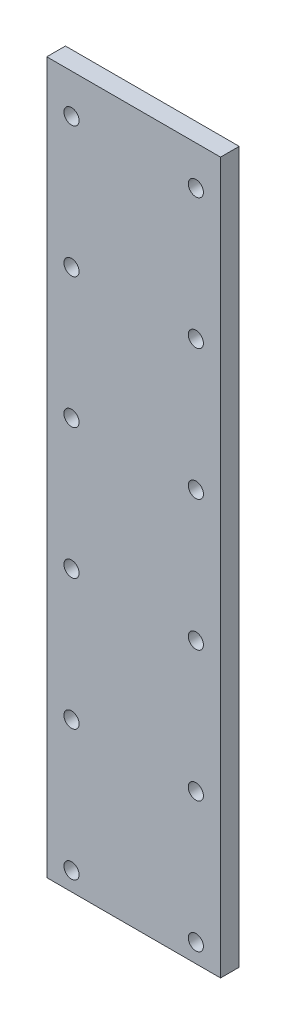
ISO-10303-21;
HEADER;
FILE_DESCRIPTION(('STEP AP214'),'2;1');
FILE_NAME('part.step','',(''),(''),'','','');
FILE_SCHEMA(('AUTOMOTIVE_DESIGN { 1 0 10303 214 1 1 1 1 }'));
ENDSEC;
DATA;
#1=APPLICATION_CONTEXT('core data for automotive mechanical design processes');
#2=APPLICATION_PROTOCOL_DEFINITION('international standard','automotive_design',2000,#1);
#3=PRODUCT_CONTEXT('',#1,'mechanical');
#4=PRODUCT('Part','Part','',(#3));
#5=PRODUCT_RELATED_PRODUCT_CATEGORY('part','',(#4));
#6=PRODUCT_DEFINITION_FORMATION('','',#4);
#7=PRODUCT_DEFINITION_CONTEXT('part definition',#1,'design');
#8=PRODUCT_DEFINITION('design','',#6,#7);
#9=PRODUCT_DEFINITION_SHAPE('','',#8);
#10=(LENGTH_UNIT() NAMED_UNIT(*) SI_UNIT(.MILLI.,.METRE.));
#11=(NAMED_UNIT(*) PLANE_ANGLE_UNIT() SI_UNIT($,.RADIAN.));
#12=(NAMED_UNIT(*) SI_UNIT($,.STERADIAN.) SOLID_ANGLE_UNIT());
#13=UNCERTAINTY_MEASURE_WITH_UNIT(LENGTH_MEASURE(1.E-05),#10,'distance_accuracy_value','');
#14=(GEOMETRIC_REPRESENTATION_CONTEXT(3) GLOBAL_UNCERTAINTY_ASSIGNED_CONTEXT((#13)) GLOBAL_UNIT_ASSIGNED_CONTEXT((#10,
#11,#12)) REPRESENTATION_CONTEXT('',''));
#15=CARTESIAN_POINT('',(0.,0.,0.));
#16=DIRECTION('',(0.,0.,1.));
#17=DIRECTION('',(1.,0.,0.));
#18=AXIS2_PLACEMENT_3D('',#15,#16,#17);
#19=CARTESIAN_POINT('',(9.9949,50.85,0.));
#20=DIRECTION('',(0.,0.,1.));
#21=DIRECTION('',(1.,0.,0.));
#22=AXIS2_PLACEMENT_3D('',#19,#20,#21);
#23=CYLINDRICAL_SURFACE('',#22,1.2192);
#24=CARTESIAN_POINT('',(9.9949,50.85,0.));
#25=DIRECTION('',(0.,0.,1.));
#26=DIRECTION('',(1.,0.,0.));
#27=AXIS2_PLACEMENT_3D('',#24,#25,#26);
#28=CIRCLE('',#27,1.2192);
#29=CARTESIAN_POINT('',(11.2141,50.85,0.));
#30=VERTEX_POINT('',#29);
#31=EDGE_CURVE('E53',#30,#30,#28,.T.);
#32=ORIENTED_EDGE('',*,*,#31,.F.);
#33=EDGE_LOOP('',(#32));
#34=FACE_BOUND('',#33,.T.);
#35=CARTESIAN_POINT('',(9.9949,50.85,3.));
#36=DIRECTION('',(0.,0.,1.));
#37=DIRECTION('',(1.,0.,0.));
#38=AXIS2_PLACEMENT_3D('',#35,#36,#37);
#39=CIRCLE('',#38,1.2192);
#40=CARTESIAN_POINT('',(11.2141,50.85,3.));
#41=VERTEX_POINT('',#40);
#42=EDGE_CURVE('E11',#41,#41,#39,.T.);
#43=ORIENTED_EDGE('',*,*,#42,.T.);
#44=EDGE_LOOP('',(#43));
#45=FACE_BOUND('',#44,.T.);
#46=ADVANCED_FACE('F44',(#34,#45),#23,.F.);
#47=CARTESIAN_POINT('',(9.9949,29.85,0.));
#48=DIRECTION('',(0.,0.,1.));
#49=DIRECTION('',(1.,0.,0.));
#50=AXIS2_PLACEMENT_3D('',#47,#48,#49);
#51=CYLINDRICAL_SURFACE('',#50,1.2192);
#52=CARTESIAN_POINT('',(9.9949,29.85,0.));
#53=DIRECTION('',(0.,0.,1.));
#54=DIRECTION('',(1.,0.,0.));
#55=AXIS2_PLACEMENT_3D('',#52,#53,#54);
#56=CIRCLE('',#55,1.2192);
#57=CARTESIAN_POINT('',(11.2141,29.85,0.));
#58=VERTEX_POINT('',#57);
#59=EDGE_CURVE('E182',#58,#58,#56,.T.);
#60=ORIENTED_EDGE('',*,*,#59,.F.);
#61=EDGE_LOOP('',(#60));
#62=FACE_BOUND('',#61,.T.);
#63=CARTESIAN_POINT('',(9.9949,29.85,3.));
#64=DIRECTION('',(0.,0.,1.));
#65=DIRECTION('',(1.,0.,0.));
#66=AXIS2_PLACEMENT_3D('',#63,#64,#65);
#67=CIRCLE('',#66,1.2192);
#68=CARTESIAN_POINT('',(11.2141,29.85,3.));
#69=VERTEX_POINT('',#68);
#70=EDGE_CURVE('E186',#69,#69,#67,.T.);
#71=ORIENTED_EDGE('',*,*,#70,.T.);
#72=EDGE_LOOP('',(#71));
#73=FACE_BOUND('',#72,.T.);
#74=ADVANCED_FACE('F197',(#62,#73),#51,.F.);
#75=CARTESIAN_POINT('',(9.9949,8.84999999999998,0.));
#76=DIRECTION('',(0.,0.,1.));
#77=DIRECTION('',(1.,0.,0.));
#78=AXIS2_PLACEMENT_3D('',#75,#76,#77);
#79=CYLINDRICAL_SURFACE('',#78,1.2192);
#80=CARTESIAN_POINT('',(9.9949,8.84999999999998,0.));
#81=DIRECTION('',(0.,0.,1.));
#82=DIRECTION('',(1.,0.,0.));
#83=AXIS2_PLACEMENT_3D('',#80,#81,#82);
#84=CIRCLE('',#83,1.2192);
#85=CARTESIAN_POINT('',(11.2141,8.84999999999998,0.));
#86=VERTEX_POINT('',#85);
#87=EDGE_CURVE('E174',#86,#86,#84,.T.);
#88=ORIENTED_EDGE('',*,*,#87,.F.);
#89=EDGE_LOOP('',(#88));
#90=FACE_BOUND('',#89,.T.);
#91=CARTESIAN_POINT('',(9.9949,8.84999999999998,3.));
#92=DIRECTION('',(0.,0.,1.));
#93=DIRECTION('',(1.,0.,0.));
#94=AXIS2_PLACEMENT_3D('',#91,#92,#93);
#95=CIRCLE('',#94,1.2192);
#96=CARTESIAN_POINT('',(11.2141,8.84999999999998,3.));
#97=VERTEX_POINT('',#96);
#98=EDGE_CURVE('E178',#97,#97,#95,.T.);
#99=ORIENTED_EDGE('',*,*,#98,.T.);
#100=EDGE_LOOP('',(#99));
#101=FACE_BOUND('',#100,.T.);
#102=ADVANCED_FACE('F244',(#90,#101),#79,.F.);
#103=CARTESIAN_POINT('',(9.9949,-12.15,0.));
#104=DIRECTION('',(0.,0.,1.));
#105=DIRECTION('',(1.,0.,0.));
#106=AXIS2_PLACEMENT_3D('',#103,#104,#105);
#107=CYLINDRICAL_SURFACE('',#106,1.2192);
#108=CARTESIAN_POINT('',(9.9949,-12.15,0.));
#109=DIRECTION('',(0.,0.,1.));
#110=DIRECTION('',(1.,0.,0.));
#111=AXIS2_PLACEMENT_3D('',#108,#109,#110);
#112=CIRCLE('',#111,1.2192);
#113=CARTESIAN_POINT('',(11.2141,-12.15,0.));
#114=VERTEX_POINT('',#113);
#115=EDGE_CURVE('E166',#114,#114,#112,.T.);
#116=ORIENTED_EDGE('',*,*,#115,.F.);
#117=EDGE_LOOP('',(#116));
#118=FACE_BOUND('',#117,.T.);
#119=CARTESIAN_POINT('',(9.9949,-12.15,3.));
#120=DIRECTION('',(0.,0.,1.));
#121=DIRECTION('',(1.,0.,0.));
#122=AXIS2_PLACEMENT_3D('',#119,#120,#121);
#123=CIRCLE('',#122,1.2192);
#124=CARTESIAN_POINT('',(11.2141,-12.15,3.));
#125=VERTEX_POINT('',#124);
#126=EDGE_CURVE('E170',#125,#125,#123,.T.);
#127=ORIENTED_EDGE('',*,*,#126,.T.);
#128=EDGE_LOOP('',(#127));
#129=FACE_BOUND('',#128,.T.);
#130=ADVANCED_FACE('F240',(#118,#129),#107,.F.);
#131=CARTESIAN_POINT('',(-9.9949,50.85,0.));
#132=DIRECTION('',(0.,0.,1.));
#133=DIRECTION('',(1.,0.,0.));
#134=AXIS2_PLACEMENT_3D('',#131,#132,#133);
#135=CYLINDRICAL_SURFACE('',#134,1.2192);
#136=CARTESIAN_POINT('',(-9.9949,50.85,0.));
#137=DIRECTION('',(0.,0.,1.));
#138=DIRECTION('',(1.,0.,0.));
#139=AXIS2_PLACEMENT_3D('',#136,#137,#138);
#140=CIRCLE('',#139,1.2192);
#141=CARTESIAN_POINT('',(-8.7757,50.85,0.));
#142=VERTEX_POINT('',#141);
#143=EDGE_CURVE('E158',#142,#142,#140,.T.);
#144=ORIENTED_EDGE('',*,*,#143,.F.);
#145=EDGE_LOOP('',(#144));
#146=FACE_BOUND('',#145,.T.);
#147=CARTESIAN_POINT('',(-9.9949,50.85,3.));
#148=DIRECTION('',(0.,0.,1.));
#149=DIRECTION('',(1.,0.,0.));
#150=AXIS2_PLACEMENT_3D('',#147,#148,#149);
#151=CIRCLE('',#150,1.2192);
#152=CARTESIAN_POINT('',(-8.7757,50.85,3.));
#153=VERTEX_POINT('',#152);
#154=EDGE_CURVE('E162',#153,#153,#151,.T.);
#155=ORIENTED_EDGE('',*,*,#154,.T.);
#156=EDGE_LOOP('',(#155));
#157=FACE_BOUND('',#156,.T.);
#158=ADVANCED_FACE('F236',(#146,#157),#135,.F.);
#159=CARTESIAN_POINT('',(-9.9949,29.85,0.));
#160=DIRECTION('',(0.,0.,1.));
#161=DIRECTION('',(1.,0.,0.));
#162=AXIS2_PLACEMENT_3D('',#159,#160,#161);
#163=CYLINDRICAL_SURFACE('',#162,1.2192);
#164=CARTESIAN_POINT('',(-9.9949,29.85,0.));
#165=DIRECTION('',(0.,0.,1.));
#166=DIRECTION('',(1.,0.,0.));
#167=AXIS2_PLACEMENT_3D('',#164,#165,#166);
#168=CIRCLE('',#167,1.2192);
#169=CARTESIAN_POINT('',(-8.7757,29.85,0.));
#170=VERTEX_POINT('',#169);
#171=EDGE_CURVE('E150',#170,#170,#168,.T.);
#172=ORIENTED_EDGE('',*,*,#171,.F.);
#173=EDGE_LOOP('',(#172));
#174=FACE_BOUND('',#173,.T.);
#175=CARTESIAN_POINT('',(-9.9949,29.85,3.));
#176=DIRECTION('',(0.,0.,1.));
#177=DIRECTION('',(1.,0.,0.));
#178=AXIS2_PLACEMENT_3D('',#175,#176,#177);
#179=CIRCLE('',#178,1.2192);
#180=CARTESIAN_POINT('',(-8.7757,29.85,3.));
#181=VERTEX_POINT('',#180);
#182=EDGE_CURVE('E154',#181,#181,#179,.T.);
#183=ORIENTED_EDGE('',*,*,#182,.T.);
#184=EDGE_LOOP('',(#183));
#185=FACE_BOUND('',#184,.T.);
#186=ADVANCED_FACE('F232',(#174,#185),#163,.F.);
#187=CARTESIAN_POINT('',(-9.9949,8.84999999999998,0.));
#188=DIRECTION('',(0.,0.,1.));
#189=DIRECTION('',(1.,0.,0.));
#190=AXIS2_PLACEMENT_3D('',#187,#188,#189);
#191=CYLINDRICAL_SURFACE('',#190,1.2192);
#192=CARTESIAN_POINT('',(-9.9949,8.84999999999998,0.));
#193=DIRECTION('',(0.,0.,1.));
#194=DIRECTION('',(1.,0.,0.));
#195=AXIS2_PLACEMENT_3D('',#192,#193,#194);
#196=CIRCLE('',#195,1.2192);
#197=CARTESIAN_POINT('',(-8.7757,8.84999999999998,0.));
#198=VERTEX_POINT('',#197);
#199=EDGE_CURVE('E142',#198,#198,#196,.T.);
#200=ORIENTED_EDGE('',*,*,#199,.F.);
#201=EDGE_LOOP('',(#200));
#202=FACE_BOUND('',#201,.T.);
#203=CARTESIAN_POINT('',(-9.9949,8.84999999999998,3.));
#204=DIRECTION('',(0.,0.,1.));
#205=DIRECTION('',(1.,0.,0.));
#206=AXIS2_PLACEMENT_3D('',#203,#204,#205);
#207=CIRCLE('',#206,1.2192);
#208=CARTESIAN_POINT('',(-8.7757,8.84999999999998,3.));
#209=VERTEX_POINT('',#208);
#210=EDGE_CURVE('E146',#209,#209,#207,.T.);
#211=ORIENTED_EDGE('',*,*,#210,.T.);
#212=EDGE_LOOP('',(#211));
#213=FACE_BOUND('',#212,.T.);
#214=ADVANCED_FACE('F228',(#202,#213),#191,.F.);
#215=CARTESIAN_POINT('',(-9.9949,-12.15,0.));
#216=DIRECTION('',(0.,0.,1.));
#217=DIRECTION('',(1.,0.,0.));
#218=AXIS2_PLACEMENT_3D('',#215,#216,#217);
#219=CYLINDRICAL_SURFACE('',#218,1.2192);
#220=CARTESIAN_POINT('',(-9.9949,-12.15,0.));
#221=DIRECTION('',(0.,0.,1.));
#222=DIRECTION('',(1.,0.,0.));
#223=AXIS2_PLACEMENT_3D('',#220,#221,#222);
#224=CIRCLE('',#223,1.2192);
#225=CARTESIAN_POINT('',(-8.7757,-12.15,0.));
#226=VERTEX_POINT('',#225);
#227=EDGE_CURVE('E134',#226,#226,#224,.T.);
#228=ORIENTED_EDGE('',*,*,#227,.F.);
#229=EDGE_LOOP('',(#228));
#230=FACE_BOUND('',#229,.T.);
#231=CARTESIAN_POINT('',(-9.9949,-12.15,3.));
#232=DIRECTION('',(0.,0.,1.));
#233=DIRECTION('',(1.,0.,0.));
#234=AXIS2_PLACEMENT_3D('',#231,#232,#233);
#235=CIRCLE('',#234,1.2192);
#236=CARTESIAN_POINT('',(-8.7757,-12.15,3.));
#237=VERTEX_POINT('',#236);
#238=EDGE_CURVE('E138',#237,#237,#235,.T.);
#239=ORIENTED_EDGE('',*,*,#238,.T.);
#240=EDGE_LOOP('',(#239));
#241=FACE_BOUND('',#240,.T.);
#242=ADVANCED_FACE('F225',(#230,#241),#219,.F.);
#243=CARTESIAN_POINT('',(13.97,-57.15,3.));
#244=DIRECTION('',(-1.,0.,0.));
#245=DIRECTION('',(0.,0.,1.));
#246=AXIS2_PLACEMENT_3D('',#243,#244,#245);
#247=PLANE('',#246);
#248=DIRECTION('',(0.,1.,0.));
#249=VECTOR('',#248,1.);
#250=CARTESIAN_POINT('',(13.97,-57.15,0.));
#251=LINE('',#250,#249);
#252=CARTESIAN_POINT('',(13.97,-57.15,0.));
#253=VERTEX_POINT('',#252);
#254=CARTESIAN_POINT('',(13.97,57.15,0.));
#255=VERTEX_POINT('',#254);
#256=EDGE_CURVE('E117',#253,#255,#251,.T.);
#257=ORIENTED_EDGE('',*,*,#256,.T.);
#258=DIRECTION('',(0.,0.,-1.));
#259=VECTOR('',#258,1.);
#260=CARTESIAN_POINT('',(13.97,57.15,3.));
#261=LINE('',#260,#259);
#262=CARTESIAN_POINT('',(13.97,57.15,3.));
#263=VERTEX_POINT('',#262);
#264=EDGE_CURVE('E106',#263,#255,#261,.T.);
#265=ORIENTED_EDGE('',*,*,#264,.F.);
#266=DIRECTION('',(0.,1.,0.));
#267=VECTOR('',#266,1.);
#268=CARTESIAN_POINT('',(13.97,-57.15,3.));
#269=LINE('',#268,#267);
#270=CARTESIAN_POINT('',(13.97,-57.15,3.));
#271=VERTEX_POINT('',#270);
#272=EDGE_CURVE('E98',#271,#263,#269,.T.);
#273=ORIENTED_EDGE('',*,*,#272,.F.);
#274=DIRECTION('',(0.,0.,-1.));
#275=VECTOR('',#274,1.);
#276=CARTESIAN_POINT('',(13.97,-57.15,3.));
#277=LINE('',#276,#275);
#278=EDGE_CURVE('E113',#271,#253,#277,.T.);
#279=ORIENTED_EDGE('',*,*,#278,.T.);
#280=EDGE_LOOP('',(#257,#265,#273,#279));
#281=FACE_BOUND('',#280,.T.);
#282=ADVANCED_FACE('F222',(#281),#247,.F.);
#283=CARTESIAN_POINT('',(-13.97,57.15,3.));
#284=DIRECTION('',(0.,-1.,0.));
#285=DIRECTION('',(0.,0.,-1.));
#286=AXIS2_PLACEMENT_3D('',#283,#284,#285);
#287=PLANE('',#286);
#288=DIRECTION('',(-1.,0.,0.));
#289=VECTOR('',#288,1.);
#290=CARTESIAN_POINT('',(-13.97,57.15,0.));
#291=LINE('',#290,#289);
#292=CARTESIAN_POINT('',(-13.97,57.15,0.));
#293=VERTEX_POINT('',#292);
#294=EDGE_CURVE('E104',#255,#293,#291,.T.);
#295=ORIENTED_EDGE('',*,*,#294,.T.);
#296=DIRECTION('',(0.,0.,-1.));
#297=VECTOR('',#296,1.);
#298=CARTESIAN_POINT('',(-13.97,57.15,3.));
#299=LINE('',#298,#297);
#300=CARTESIAN_POINT('',(-13.97,57.15,3.));
#301=VERTEX_POINT('',#300);
#302=EDGE_CURVE('E102',#301,#293,#299,.T.);
#303=ORIENTED_EDGE('',*,*,#302,.F.);
#304=DIRECTION('',(-1.,0.,0.));
#305=VECTOR('',#304,1.);
#306=CARTESIAN_POINT('',(-13.97,57.15,3.));
#307=LINE('',#306,#305);
#308=EDGE_CURVE('E92',#263,#301,#307,.T.);
#309=ORIENTED_EDGE('',*,*,#308,.F.);
#310=ORIENTED_EDGE('',*,*,#264,.T.);
#311=EDGE_LOOP('',(#295,#303,#309,#310));
#312=FACE_BOUND('',#311,.T.);
#313=ADVANCED_FACE('F103',(#312),#287,.F.);
#314=CARTESIAN_POINT('',(-13.97,-57.15,3.));
#315=DIRECTION('',(1.,0.,0.));
#316=DIRECTION('',(0.,0.,-1.));
#317=AXIS2_PLACEMENT_3D('',#314,#315,#316);
#318=PLANE('',#317);
#319=DIRECTION('',(0.,-1.,0.));
#320=VECTOR('',#319,1.);
#321=CARTESIAN_POINT('',(-13.97,-57.15,0.));
#322=LINE('',#321,#320);
#323=CARTESIAN_POINT('',(-13.97,-57.15,0.));
#324=VERTEX_POINT('',#323);
#325=EDGE_CURVE('E78',#293,#324,#322,.T.);
#326=ORIENTED_EDGE('',*,*,#325,.T.);
#327=DIRECTION('',(0.,0.,-1.));
#328=VECTOR('',#327,1.);
#329=CARTESIAN_POINT('',(-13.97,-57.15,3.));
#330=LINE('',#329,#328);
#331=CARTESIAN_POINT('',(-13.97,-57.15,3.));
#332=VERTEX_POINT('',#331);
#333=EDGE_CURVE('E107',#332,#324,#330,.T.);
#334=ORIENTED_EDGE('',*,*,#333,.F.);
#335=DIRECTION('',(0.,-1.,0.));
#336=VECTOR('',#335,1.);
#337=CARTESIAN_POINT('',(-13.97,-57.15,3.));
#338=LINE('',#337,#336);
#339=EDGE_CURVE('E96',#301,#332,#338,.T.);
#340=ORIENTED_EDGE('',*,*,#339,.F.);
#341=ORIENTED_EDGE('',*,*,#302,.T.);
#342=EDGE_LOOP('',(#326,#334,#340,#341));
#343=FACE_BOUND('',#342,.T.);
#344=ADVANCED_FACE('F109',(#343),#318,.F.);
#345=CARTESIAN_POINT('',(-13.97,-57.15,3.));
#346=DIRECTION('',(0.,1.,0.));
#347=DIRECTION('',(0.,0.,1.));
#348=AXIS2_PLACEMENT_3D('',#345,#346,#347);
#349=PLANE('',#348);
#350=DIRECTION('',(1.,0.,0.));
#351=VECTOR('',#350,1.);
#352=CARTESIAN_POINT('',(-13.97,-57.15,0.));
#353=LINE('',#352,#351);
#354=EDGE_CURVE('E84',#324,#253,#353,.T.);
#355=ORIENTED_EDGE('',*,*,#354,.T.);
#356=ORIENTED_EDGE('',*,*,#278,.F.);
#357=DIRECTION('',(1.,0.,0.));
#358=VECTOR('',#357,1.);
#359=CARTESIAN_POINT('',(-13.97,-57.15,3.));
#360=LINE('',#359,#358);
#361=EDGE_CURVE('E61',#332,#271,#360,.T.);
#362=ORIENTED_EDGE('',*,*,#361,.F.);
#363=ORIENTED_EDGE('',*,*,#333,.T.);
#364=EDGE_LOOP('',(#355,#356,#362,#363));
#365=FACE_BOUND('',#364,.T.);
#366=ADVANCED_FACE('F201',(#365),#349,.F.);
#367=CARTESIAN_POINT('',(0.,0.,3.));
#368=DIRECTION('',(0.,0.,-1.));
#369=DIRECTION('',(-1.,0.,0.));
#370=AXIS2_PLACEMENT_3D('',#367,#368,#369);
#371=PLANE('',#370);
#372=CARTESIAN_POINT('',(9.9949,-33.15,3.));
#373=DIRECTION('',(0.,0.,1.));
#374=DIRECTION('',(1.,0.,0.));
#375=AXIS2_PLACEMENT_3D('',#372,#373,#374);
#376=CIRCLE('',#375,1.2192);
#377=CARTESIAN_POINT('',(11.2141,-33.15,3.));
#378=VERTEX_POINT('',#377);
#379=EDGE_CURVE('E435',#378,#378,#376,.T.);
#380=ORIENTED_EDGE('',*,*,#379,.F.);
#381=EDGE_LOOP('',(#380));
#382=FACE_BOUND('',#381,.T.);
#383=CARTESIAN_POINT('',(-9.9949,-33.15,3.));
#384=DIRECTION('',(0.,0.,1.));
#385=DIRECTION('',(1.,0.,0.));
#386=AXIS2_PLACEMENT_3D('',#383,#384,#385);
#387=CIRCLE('',#386,1.2192);
#388=CARTESIAN_POINT('',(-8.7757,-33.15,3.));
#389=VERTEX_POINT('',#388);
#390=EDGE_CURVE('E419',#389,#389,#387,.T.);
#391=ORIENTED_EDGE('',*,*,#390,.F.);
#392=EDGE_LOOP('',(#391));
#393=FACE_BOUND('',#392,.T.);
#394=CARTESIAN_POINT('',(-9.9949,-54.15,3.));
#395=DIRECTION('',(0.,0.,1.));
#396=DIRECTION('',(1.,0.,0.));
#397=AXIS2_PLACEMENT_3D('',#394,#395,#396);
#398=CIRCLE('',#397,1.2192);
#399=CARTESIAN_POINT('',(-8.7757,-54.15,3.));
#400=VERTEX_POINT('',#399);
#401=EDGE_CURVE('E413',#400,#400,#398,.T.);
#402=ORIENTED_EDGE('',*,*,#401,.F.);
#403=EDGE_LOOP('',(#402));
#404=FACE_BOUND('',#403,.T.);
#405=CARTESIAN_POINT('',(9.9949,-54.15,3.));
#406=DIRECTION('',(0.,0.,1.));
#407=DIRECTION('',(1.,0.,0.));
#408=AXIS2_PLACEMENT_3D('',#405,#406,#407);
#409=CIRCLE('',#408,1.2192);
#410=CARTESIAN_POINT('',(11.2141,-54.15,3.));
#411=VERTEX_POINT('',#410);
#412=EDGE_CURVE('E410',#411,#411,#409,.T.);
#413=ORIENTED_EDGE('',*,*,#412,.F.);
#414=EDGE_LOOP('',(#413));
#415=FACE_BOUND('',#414,.T.);
#416=ORIENTED_EDGE('',*,*,#272,.T.);
#417=ORIENTED_EDGE('',*,*,#308,.T.);
#418=ORIENTED_EDGE('',*,*,#339,.T.);
#419=ORIENTED_EDGE('',*,*,#361,.T.);
#420=EDGE_LOOP('',(#416,#417,#418,#419));
#421=FACE_BOUND('',#420,.T.);
#422=ORIENTED_EDGE('',*,*,#238,.F.);
#423=EDGE_LOOP('',(#422));
#424=FACE_BOUND('',#423,.T.);
#425=ORIENTED_EDGE('',*,*,#210,.F.);
#426=EDGE_LOOP('',(#425));
#427=FACE_BOUND('',#426,.T.);
#428=ORIENTED_EDGE('',*,*,#182,.F.);
#429=EDGE_LOOP('',(#428));
#430=FACE_BOUND('',#429,.T.);
#431=ORIENTED_EDGE('',*,*,#154,.F.);
#432=EDGE_LOOP('',(#431));
#433=FACE_BOUND('',#432,.T.);
#434=ORIENTED_EDGE('',*,*,#126,.F.);
#435=EDGE_LOOP('',(#434));
#436=FACE_BOUND('',#435,.T.);
#437=ORIENTED_EDGE('',*,*,#98,.F.);
#438=EDGE_LOOP('',(#437));
#439=FACE_BOUND('',#438,.T.);
#440=ORIENTED_EDGE('',*,*,#70,.F.);
#441=EDGE_LOOP('',(#440));
#442=FACE_BOUND('',#441,.T.);
#443=ORIENTED_EDGE('',*,*,#42,.F.);
#444=EDGE_LOOP('',(#443));
#445=FACE_BOUND('',#444,.T.);
#446=ADVANCED_FACE('F93',(#382,#393,#404,#415,#421,#424,#427,#430,#433,#436,#439,#442,#445),
#371,.F.);
#447=CARTESIAN_POINT('',(0.,0.,0.));
#448=DIRECTION('',(0.,0.,-1.));
#449=DIRECTION('',(-1.,0.,0.));
#450=AXIS2_PLACEMENT_3D('',#447,#448,#449);
#451=PLANE('',#450);
#452=CARTESIAN_POINT('',(9.9949,-33.15,0.));
#453=DIRECTION('',(0.,0.,1.));
#454=DIRECTION('',(1.,0.,0.));
#455=AXIS2_PLACEMENT_3D('',#452,#453,#454);
#456=CIRCLE('',#455,1.2192);
#457=CARTESIAN_POINT('',(11.2141,-33.15,0.));
#458=VERTEX_POINT('',#457);
#459=EDGE_CURVE('E439',#458,#458,#456,.T.);
#460=ORIENTED_EDGE('',*,*,#459,.T.);
#461=EDGE_LOOP('',(#460));
#462=FACE_BOUND('',#461,.T.);
#463=CARTESIAN_POINT('',(-9.9949,-33.15,0.));
#464=DIRECTION('',(0.,0.,1.));
#465=DIRECTION('',(1.,0.,0.));
#466=AXIS2_PLACEMENT_3D('',#463,#464,#465);
#467=CIRCLE('',#466,1.2192);
#468=CARTESIAN_POINT('',(-8.7757,-33.15,0.));
#469=VERTEX_POINT('',#468);
#470=EDGE_CURVE('E431',#469,#469,#467,.T.);
#471=ORIENTED_EDGE('',*,*,#470,.T.);
#472=EDGE_LOOP('',(#471));
#473=FACE_BOUND('',#472,.T.);
#474=CARTESIAN_POINT('',(-9.9949,-54.15,0.));
#475=DIRECTION('',(0.,0.,1.));
#476=DIRECTION('',(1.,0.,0.));
#477=AXIS2_PLACEMENT_3D('',#474,#475,#476);
#478=CIRCLE('',#477,1.2192);
#479=CARTESIAN_POINT('',(-8.7757,-54.15,0.));
#480=VERTEX_POINT('',#479);
#481=EDGE_CURVE('E121',#480,#480,#478,.T.);
#482=ORIENTED_EDGE('',*,*,#481,.T.);
#483=EDGE_LOOP('',(#482));
#484=FACE_BOUND('',#483,.T.);
#485=CARTESIAN_POINT('',(9.9949,-54.15,0.));
#486=DIRECTION('',(0.,0.,1.));
#487=DIRECTION('',(1.,0.,0.));
#488=AXIS2_PLACEMENT_3D('',#485,#486,#487);
#489=CIRCLE('',#488,1.2192);
#490=CARTESIAN_POINT('',(11.2141,-54.15,0.));
#491=VERTEX_POINT('',#490);
#492=EDGE_CURVE('E407',#491,#491,#489,.T.);
#493=ORIENTED_EDGE('',*,*,#492,.T.);
#494=EDGE_LOOP('',(#493));
#495=FACE_BOUND('',#494,.T.);
#496=ORIENTED_EDGE('',*,*,#256,.F.);
#497=ORIENTED_EDGE('',*,*,#354,.F.);
#498=ORIENTED_EDGE('',*,*,#325,.F.);
#499=ORIENTED_EDGE('',*,*,#294,.F.);
#500=EDGE_LOOP('',(#496,#497,#498,#499));
#501=FACE_BOUND('',#500,.T.);
#502=ORIENTED_EDGE('',*,*,#227,.T.);
#503=EDGE_LOOP('',(#502));
#504=FACE_BOUND('',#503,.T.);
#505=ORIENTED_EDGE('',*,*,#199,.T.);
#506=EDGE_LOOP('',(#505));
#507=FACE_BOUND('',#506,.T.);
#508=ORIENTED_EDGE('',*,*,#171,.T.);
#509=EDGE_LOOP('',(#508));
#510=FACE_BOUND('',#509,.T.);
#511=ORIENTED_EDGE('',*,*,#143,.T.);
#512=EDGE_LOOP('',(#511));
#513=FACE_BOUND('',#512,.T.);
#514=ORIENTED_EDGE('',*,*,#115,.T.);
#515=EDGE_LOOP('',(#514));
#516=FACE_BOUND('',#515,.T.);
#517=ORIENTED_EDGE('',*,*,#87,.T.);
#518=EDGE_LOOP('',(#517));
#519=FACE_BOUND('',#518,.T.);
#520=ORIENTED_EDGE('',*,*,#59,.T.);
#521=EDGE_LOOP('',(#520));
#522=FACE_BOUND('',#521,.T.);
#523=ORIENTED_EDGE('',*,*,#31,.T.);
#524=EDGE_LOOP('',(#523));
#525=FACE_BOUND('',#524,.T.);
#526=ADVANCED_FACE('F193',(#462,#473,#484,#495,#501,#504,#507,#510,#513,#516,#519,#522,#525),
#451,.T.);
#527=CARTESIAN_POINT('',(9.9949,-54.15,0.));
#528=DIRECTION('',(0.,0.,1.));
#529=DIRECTION('',(1.,0.,0.));
#530=AXIS2_PLACEMENT_3D('',#527,#528,#529);
#531=CYLINDRICAL_SURFACE('',#530,1.2192);
#532=ORIENTED_EDGE('',*,*,#492,.F.);
#533=EDGE_LOOP('',(#532));
#534=FACE_BOUND('',#533,.T.);
#535=ORIENTED_EDGE('',*,*,#412,.T.);
#536=EDGE_LOOP('',(#535));
#537=FACE_BOUND('',#536,.T.);
#538=ADVANCED_FACE('F208',(#534,#537),#531,.F.);
#539=CARTESIAN_POINT('',(-9.9949,-54.15,0.));
#540=DIRECTION('',(0.,0.,1.));
#541=DIRECTION('',(1.,0.,0.));
#542=AXIS2_PLACEMENT_3D('',#539,#540,#541);
#543=CYLINDRICAL_SURFACE('',#542,1.2192);
#544=ORIENTED_EDGE('',*,*,#481,.F.);
#545=EDGE_LOOP('',(#544));
#546=FACE_BOUND('',#545,.T.);
#547=ORIENTED_EDGE('',*,*,#401,.T.);
#548=EDGE_LOOP('',(#547));
#549=FACE_BOUND('',#548,.T.);
#550=ADVANCED_FACE('F304',(#546,#549),#543,.F.);
#551=CARTESIAN_POINT('',(-9.9949,-33.15,0.));
#552=DIRECTION('',(0.,0.,1.));
#553=DIRECTION('',(1.,0.,0.));
#554=AXIS2_PLACEMENT_3D('',#551,#552,#553);
#555=CYLINDRICAL_SURFACE('',#554,1.2192);
#556=ORIENTED_EDGE('',*,*,#470,.F.);
#557=EDGE_LOOP('',(#556));
#558=FACE_BOUND('',#557,.T.);
#559=ORIENTED_EDGE('',*,*,#390,.T.);
#560=EDGE_LOOP('',(#559));
#561=FACE_BOUND('',#560,.T.);
#562=ADVANCED_FACE('F297',(#558,#561),#555,.F.);
#563=CARTESIAN_POINT('',(9.9949,-33.15,0.));
#564=DIRECTION('',(0.,0.,1.));
#565=DIRECTION('',(1.,0.,0.));
#566=AXIS2_PLACEMENT_3D('',#563,#564,#565);
#567=CYLINDRICAL_SURFACE('',#566,1.2192);
#568=ORIENTED_EDGE('',*,*,#459,.F.);
#569=EDGE_LOOP('',(#568));
#570=FACE_BOUND('',#569,.T.);
#571=ORIENTED_EDGE('',*,*,#379,.T.);
#572=EDGE_LOOP('',(#571));
#573=FACE_BOUND('',#572,.T.);
#574=ADVANCED_FACE('F303',(#570,#573),#567,.F.);
#575=CLOSED_SHELL('',(#46,#74,#102,#130,#158,#186,#214,#242,#282,#313,#344,#366,#446,#526,#538,
#550,#562,#574));
#576=MANIFOLD_SOLID_BREP('B2',#575);
#577=ADVANCED_BREP_SHAPE_REPRESENTATION('',(#18,#576),#14);
#578=SHAPE_DEFINITION_REPRESENTATION(#9,#577);
ENDSEC;
END-ISO-10303-21;
